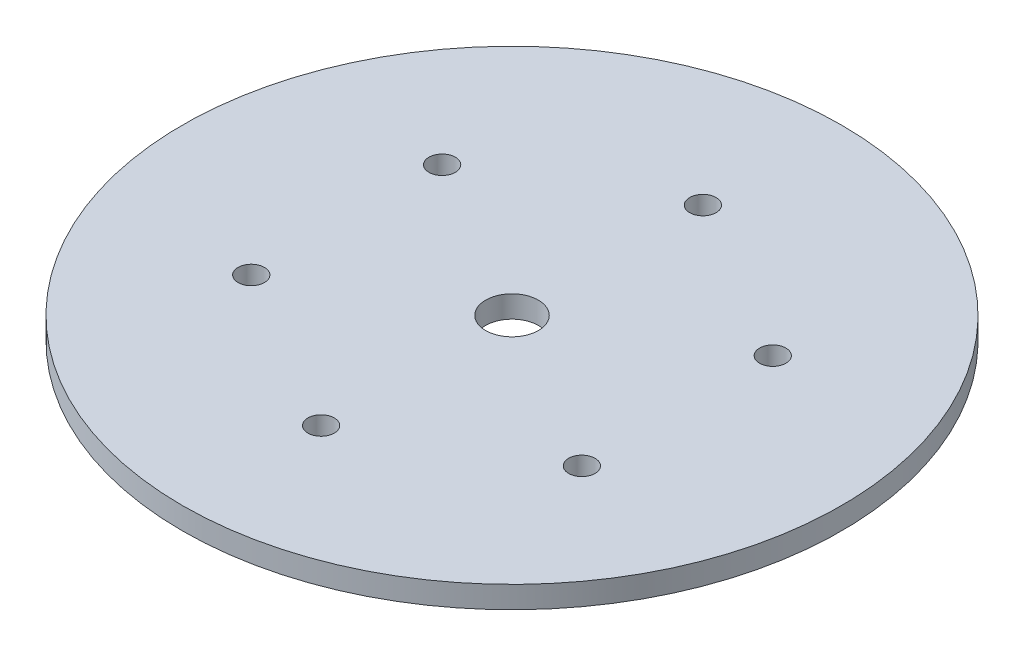
ISO-10303-21;
HEADER;
FILE_DESCRIPTION(('STEP AP214'),'2;1');
FILE_NAME('part.step','',(''),(''),'','','');
FILE_SCHEMA(('AUTOMOTIVE_DESIGN { 1 0 10303 214 1 1 1 1 }'));
ENDSEC;
DATA;
#1=APPLICATION_CONTEXT('core data for automotive mechanical design processes');
#2=APPLICATION_PROTOCOL_DEFINITION('international standard','automotive_design',2000,#1);
#3=PRODUCT_CONTEXT('',#1,'mechanical');
#4=PRODUCT('Part','Part','',(#3));
#5=PRODUCT_RELATED_PRODUCT_CATEGORY('part','',(#4));
#6=PRODUCT_DEFINITION_FORMATION('','',#4);
#7=PRODUCT_DEFINITION_CONTEXT('part definition',#1,'design');
#8=PRODUCT_DEFINITION('design','',#6,#7);
#9=PRODUCT_DEFINITION_SHAPE('','',#8);
#10=(LENGTH_UNIT() NAMED_UNIT(*) SI_UNIT(.MILLI.,.METRE.));
#11=(NAMED_UNIT(*) PLANE_ANGLE_UNIT() SI_UNIT($,.RADIAN.));
#12=(NAMED_UNIT(*) SI_UNIT($,.STERADIAN.) SOLID_ANGLE_UNIT());
#13=UNCERTAINTY_MEASURE_WITH_UNIT(LENGTH_MEASURE(1.E-05),#10,'distance_accuracy_value','');
#14=(GEOMETRIC_REPRESENTATION_CONTEXT(3) GLOBAL_UNCERTAINTY_ASSIGNED_CONTEXT((#13)) GLOBAL_UNIT_ASSIGNED_CONTEXT((#10,
#11,#12)) REPRESENTATION_CONTEXT('',''));
#15=CARTESIAN_POINT('',(0.,0.,0.));
#16=DIRECTION('',(0.,0.,1.));
#17=DIRECTION('',(1.,0.,0.));
#18=AXIS2_PLACEMENT_3D('',#15,#16,#17);
#19=CARTESIAN_POINT('',(0.,5.,0.));
#20=DIRECTION('',(0.,1.,0.));
#21=DIRECTION('',(0.,0.,1.));
#22=AXIS2_PLACEMENT_3D('',#19,#20,#21);
#23=PLANE('',#22);
#24=CARTESIAN_POINT('',(-37.6221783508924,5.,21.7211747983921));
#25=DIRECTION('',(0.,1.,0.));
#26=DIRECTION('',(0.,0.,1.));
#27=AXIS2_PLACEMENT_3D('',#24,#25,#26);
#28=CIRCLE('',#27,3.00000000000457);
#29=CARTESIAN_POINT('',(-37.6221783508924,5.,24.7211747983967));
#30=VERTEX_POINT('',#29);
#31=EDGE_CURVE('E73',#30,#30,#28,.T.);
#32=ORIENTED_EDGE('',*,*,#31,.F.);
#33=EDGE_LOOP('',(#32));
#34=FACE_BOUND('',#33,.T.);
#35=CARTESIAN_POINT('',(37.6221783508998,5.,21.7211747983879));
#36=DIRECTION('',(0.,1.,0.));
#37=DIRECTION('',(0.,0.,1.));
#38=AXIS2_PLACEMENT_3D('',#35,#36,#37);
#39=CIRCLE('',#38,3.0000000000031);
#40=CARTESIAN_POINT('',(37.6221783508998,5.,24.721174798391));
#41=VERTEX_POINT('',#40);
#42=EDGE_CURVE('E61',#41,#41,#39,.T.);
#43=ORIENTED_EDGE('',*,*,#42,.F.);
#44=EDGE_LOOP('',(#43));
#45=FACE_BOUND('',#44,.T.);
#46=CARTESIAN_POINT('',(0.,5.,0.));
#47=DIRECTION('',(0.,1.,0.));
#48=DIRECTION('',(0.,0.,1.));
#49=AXIS2_PLACEMENT_3D('',#46,#47,#48);
#50=CIRCLE('',#49,6.);
#51=CARTESIAN_POINT('',(0.,5.,6.));
#52=VERTEX_POINT('',#51);
#53=EDGE_CURVE('E49',#52,#52,#50,.T.);
#54=ORIENTED_EDGE('',*,*,#53,.F.);
#55=EDGE_LOOP('',(#54));
#56=FACE_BOUND('',#55,.T.);
#57=CARTESIAN_POINT('',(0.,5.,0.));
#58=DIRECTION('',(0.,1.,0.));
#59=DIRECTION('',(0.,0.,1.));
#60=AXIS2_PLACEMENT_3D('',#57,#58,#59);
#61=CIRCLE('',#60,75.);
#62=CARTESIAN_POINT('',(0.,5.,75.));
#63=VERTEX_POINT('',#62);
#64=EDGE_CURVE('E10',#63,#63,#61,.T.);
#65=ORIENTED_EDGE('',*,*,#64,.T.);
#66=EDGE_LOOP('',(#65));
#67=FACE_BOUND('',#66,.T.);
#68=CARTESIAN_POINT('',(0.,5.,-43.44234959678));
#69=DIRECTION('',(0.,1.,0.));
#70=DIRECTION('',(0.,0.,1.));
#71=AXIS2_PLACEMENT_3D('',#68,#69,#70);
#72=CIRCLE('',#71,3.);
#73=CARTESIAN_POINT('',(0.,5.,-40.44234959678));
#74=VERTEX_POINT('',#73);
#75=EDGE_CURVE('E44',#74,#74,#72,.T.);
#76=ORIENTED_EDGE('',*,*,#75,.F.);
#77=EDGE_LOOP('',(#76));
#78=FACE_BOUND('',#77,.T.);
#79=CARTESIAN_POINT('',(37.6221783508974,5.,-21.7211747983921));
#80=DIRECTION('',(0.,1.,0.));
#81=DIRECTION('',(0.,0.,1.));
#82=AXIS2_PLACEMENT_3D('',#79,#80,#81);
#83=CIRCLE('',#82,3.00000000000066);
#84=CARTESIAN_POINT('',(37.6221783508974,5.,-18.7211747983915));
#85=VERTEX_POINT('',#84);
#86=EDGE_CURVE('E55',#85,#85,#83,.T.);
#87=ORIENTED_EDGE('',*,*,#86,.F.);
#88=EDGE_LOOP('',(#87));
#89=FACE_BOUND('',#88,.T.);
#90=CARTESIAN_POINT('',(4.92818304197861E-12,5.,43.44234959678));
#91=DIRECTION('',(0.,1.,0.));
#92=DIRECTION('',(0.,0.,1.));
#93=AXIS2_PLACEMENT_3D('',#90,#91,#92);
#94=CIRCLE('',#93,3.000000000005);
#95=CARTESIAN_POINT('',(4.92818304197861E-12,5.,46.442349596785));
#96=VERTEX_POINT('',#95);
#97=EDGE_CURVE('E67',#96,#96,#94,.T.);
#98=ORIENTED_EDGE('',*,*,#97,.F.);
#99=EDGE_LOOP('',(#98));
#100=FACE_BOUND('',#99,.T.);
#101=CARTESIAN_POINT('',(-37.6221783508949,5.,-21.7211747983878));
#102=DIRECTION('',(0.,1.,0.));
#103=DIRECTION('',(0.,0.,1.));
#104=AXIS2_PLACEMENT_3D('',#101,#102,#103);
#105=CIRCLE('',#104,3.00000000000232);
#106=CARTESIAN_POINT('',(-37.6221783508949,5.,-18.7211747983855));
#107=VERTEX_POINT('',#106);
#108=EDGE_CURVE('E79',#107,#107,#105,.T.);
#109=ORIENTED_EDGE('',*,*,#108,.F.);
#110=EDGE_LOOP('',(#109));
#111=FACE_BOUND('',#110,.T.);
#112=ADVANCED_FACE('F33',(#34,#45,#56,#67,#78,#89,#100,#111),#23,.T.);
#113=CARTESIAN_POINT('',(0.,0.,0.));
#114=DIRECTION('',(0.,1.,0.));
#115=DIRECTION('',(0.,0.,1.));
#116=AXIS2_PLACEMENT_3D('',#113,#114,#115);
#117=PLANE('',#116);
#118=CARTESIAN_POINT('',(0.,0.,0.));
#119=DIRECTION('',(0.,1.,0.));
#120=DIRECTION('',(0.,0.,1.));
#121=AXIS2_PLACEMENT_3D('',#118,#119,#120);
#122=CIRCLE('',#121,75.);
#123=CARTESIAN_POINT('',(0.,0.,75.));
#124=VERTEX_POINT('',#123);
#125=EDGE_CURVE('E37',#124,#124,#122,.T.);
#126=ORIENTED_EDGE('',*,*,#125,.F.);
#127=EDGE_LOOP('',(#126));
#128=FACE_BOUND('',#127,.T.);
#129=CARTESIAN_POINT('',(0.,0.,-43.44234959678));
#130=DIRECTION('',(0.,1.,0.));
#131=DIRECTION('',(0.,0.,1.));
#132=AXIS2_PLACEMENT_3D('',#129,#130,#131);
#133=CIRCLE('',#132,3.);
#134=CARTESIAN_POINT('',(0.,0.,-40.44234959678));
#135=VERTEX_POINT('',#134);
#136=EDGE_CURVE('E46',#135,#135,#133,.T.);
#137=ORIENTED_EDGE('',*,*,#136,.T.);
#138=EDGE_LOOP('',(#137));
#139=FACE_BOUND('',#138,.T.);
#140=CARTESIAN_POINT('',(0.,0.,0.));
#141=DIRECTION('',(0.,1.,0.));
#142=DIRECTION('',(0.,0.,1.));
#143=AXIS2_PLACEMENT_3D('',#140,#141,#142);
#144=CIRCLE('',#143,6.);
#145=CARTESIAN_POINT('',(0.,0.,6.));
#146=VERTEX_POINT('',#145);
#147=EDGE_CURVE('E52',#146,#146,#144,.T.);
#148=ORIENTED_EDGE('',*,*,#147,.T.);
#149=EDGE_LOOP('',(#148));
#150=FACE_BOUND('',#149,.T.);
#151=CARTESIAN_POINT('',(37.6221783508974,0.,-21.7211747983921));
#152=DIRECTION('',(0.,1.,0.));
#153=DIRECTION('',(0.,0.,1.));
#154=AXIS2_PLACEMENT_3D('',#151,#152,#153);
#155=CIRCLE('',#154,3.00000000000066);
#156=CARTESIAN_POINT('',(37.6221783508974,0.,-18.7211747983915));
#157=VERTEX_POINT('',#156);
#158=EDGE_CURVE('E58',#157,#157,#155,.T.);
#159=ORIENTED_EDGE('',*,*,#158,.T.);
#160=EDGE_LOOP('',(#159));
#161=FACE_BOUND('',#160,.T.);
#162=CARTESIAN_POINT('',(37.6221783508998,0.,21.7211747983879));
#163=DIRECTION('',(0.,1.,0.));
#164=DIRECTION('',(0.,0.,1.));
#165=AXIS2_PLACEMENT_3D('',#162,#163,#164);
#166=CIRCLE('',#165,3.0000000000031);
#167=CARTESIAN_POINT('',(37.6221783508998,0.,24.721174798391));
#168=VERTEX_POINT('',#167);
#169=EDGE_CURVE('E64',#168,#168,#166,.T.);
#170=ORIENTED_EDGE('',*,*,#169,.T.);
#171=EDGE_LOOP('',(#170));
#172=FACE_BOUND('',#171,.T.);
#173=CARTESIAN_POINT('',(4.92818304197861E-12,0.,43.44234959678));
#174=DIRECTION('',(0.,1.,0.));
#175=DIRECTION('',(0.,0.,1.));
#176=AXIS2_PLACEMENT_3D('',#173,#174,#175);
#177=CIRCLE('',#176,3.000000000005);
#178=CARTESIAN_POINT('',(4.92818304197861E-12,0.,46.442349596785));
#179=VERTEX_POINT('',#178);
#180=EDGE_CURVE('E70',#179,#179,#177,.T.);
#181=ORIENTED_EDGE('',*,*,#180,.T.);
#182=EDGE_LOOP('',(#181));
#183=FACE_BOUND('',#182,.T.);
#184=CARTESIAN_POINT('',(-37.6221783508924,0.,21.7211747983921));
#185=DIRECTION('',(0.,1.,0.));
#186=DIRECTION('',(0.,0.,1.));
#187=AXIS2_PLACEMENT_3D('',#184,#185,#186);
#188=CIRCLE('',#187,3.00000000000457);
#189=CARTESIAN_POINT('',(-37.6221783508924,0.,24.7211747983967));
#190=VERTEX_POINT('',#189);
#191=EDGE_CURVE('E76',#190,#190,#188,.T.);
#192=ORIENTED_EDGE('',*,*,#191,.T.);
#193=EDGE_LOOP('',(#192));
#194=FACE_BOUND('',#193,.T.);
#195=CARTESIAN_POINT('',(-37.6221783508949,0.,-21.7211747983878));
#196=DIRECTION('',(0.,1.,0.));
#197=DIRECTION('',(0.,0.,1.));
#198=AXIS2_PLACEMENT_3D('',#195,#196,#197);
#199=CIRCLE('',#198,3.00000000000232);
#200=CARTESIAN_POINT('',(-37.6221783508949,0.,-18.7211747983855));
#201=VERTEX_POINT('',#200);
#202=EDGE_CURVE('E82',#201,#201,#199,.T.);
#203=ORIENTED_EDGE('',*,*,#202,.T.);
#204=EDGE_LOOP('',(#203));
#205=FACE_BOUND('',#204,.T.);
#206=ADVANCED_FACE('F92',(#128,#139,#150,#161,#172,#183,#194,#205),#117,.F.);
#207=CARTESIAN_POINT('',(0.,5.,0.));
#208=DIRECTION('',(0.,-1.,0.));
#209=DIRECTION('',(0.,0.,-1.));
#210=AXIS2_PLACEMENT_3D('',#207,#208,#209);
#211=CYLINDRICAL_SURFACE('',#210,75.);
#212=ORIENTED_EDGE('',*,*,#64,.F.);
#213=EDGE_LOOP('',(#212));
#214=FACE_BOUND('',#213,.T.);
#215=ORIENTED_EDGE('',*,*,#125,.T.);
#216=EDGE_LOOP('',(#215));
#217=FACE_BOUND('',#216,.T.);
#218=ADVANCED_FACE('F35',(#214,#217),#211,.T.);
#219=CARTESIAN_POINT('',(0.,5.,-43.44234959678));
#220=DIRECTION('',(0.,-1.,0.));
#221=DIRECTION('',(0.,0.,-1.));
#222=AXIS2_PLACEMENT_3D('',#219,#220,#221);
#223=CYLINDRICAL_SURFACE('',#222,3.);
#224=ORIENTED_EDGE('',*,*,#75,.T.);
#225=EDGE_LOOP('',(#224));
#226=FACE_BOUND('',#225,.T.);
#227=ORIENTED_EDGE('',*,*,#136,.F.);
#228=EDGE_LOOP('',(#227));
#229=FACE_BOUND('',#228,.T.);
#230=ADVANCED_FACE('F102',(#226,#229),#223,.F.);
#231=CARTESIAN_POINT('',(0.,5.,0.));
#232=DIRECTION('',(0.,-1.,0.));
#233=DIRECTION('',(0.,0.,-1.));
#234=AXIS2_PLACEMENT_3D('',#231,#232,#233);
#235=CYLINDRICAL_SURFACE('',#234,6.);
#236=ORIENTED_EDGE('',*,*,#53,.T.);
#237=EDGE_LOOP('',(#236));
#238=FACE_BOUND('',#237,.T.);
#239=ORIENTED_EDGE('',*,*,#147,.F.);
#240=EDGE_LOOP('',(#239));
#241=FACE_BOUND('',#240,.T.);
#242=ADVANCED_FACE('F105',(#238,#241),#235,.F.);
#243=CARTESIAN_POINT('',(37.6221783508974,5.,-21.7211747983921));
#244=DIRECTION('',(0.,-1.,0.));
#245=DIRECTION('',(0.,0.,-1.));
#246=AXIS2_PLACEMENT_3D('',#243,#244,#245);
#247=CYLINDRICAL_SURFACE('',#246,3.00000000000066);
#248=ORIENTED_EDGE('',*,*,#86,.T.);
#249=EDGE_LOOP('',(#248));
#250=FACE_BOUND('',#249,.T.);
#251=ORIENTED_EDGE('',*,*,#158,.F.);
#252=EDGE_LOOP('',(#251));
#253=FACE_BOUND('',#252,.T.);
#254=ADVANCED_FACE('F109',(#250,#253),#247,.F.);
#255=CARTESIAN_POINT('',(37.6221783508998,5.,21.7211747983879));
#256=DIRECTION('',(0.,-1.,0.));
#257=DIRECTION('',(0.,0.,-1.));
#258=AXIS2_PLACEMENT_3D('',#255,#256,#257);
#259=CYLINDRICAL_SURFACE('',#258,3.0000000000031);
#260=ORIENTED_EDGE('',*,*,#42,.T.);
#261=EDGE_LOOP('',(#260));
#262=FACE_BOUND('',#261,.T.);
#263=ORIENTED_EDGE('',*,*,#169,.F.);
#264=EDGE_LOOP('',(#263));
#265=FACE_BOUND('',#264,.T.);
#266=ADVANCED_FACE('F113',(#262,#265),#259,.F.);
#267=CARTESIAN_POINT('',(4.92818304197861E-12,5.,43.44234959678));
#268=DIRECTION('',(0.,-1.,0.));
#269=DIRECTION('',(0.,0.,-1.));
#270=AXIS2_PLACEMENT_3D('',#267,#268,#269);
#271=CYLINDRICAL_SURFACE('',#270,3.000000000005);
#272=ORIENTED_EDGE('',*,*,#97,.T.);
#273=EDGE_LOOP('',(#272));
#274=FACE_BOUND('',#273,.T.);
#275=ORIENTED_EDGE('',*,*,#180,.F.);
#276=EDGE_LOOP('',(#275));
#277=FACE_BOUND('',#276,.T.);
#278=ADVANCED_FACE('F117',(#274,#277),#271,.F.);
#279=CARTESIAN_POINT('',(-37.6221783508924,5.,21.7211747983921));
#280=DIRECTION('',(0.,-1.,0.));
#281=DIRECTION('',(0.,0.,-1.));
#282=AXIS2_PLACEMENT_3D('',#279,#280,#281);
#283=CYLINDRICAL_SURFACE('',#282,3.00000000000457);
#284=ORIENTED_EDGE('',*,*,#31,.T.);
#285=EDGE_LOOP('',(#284));
#286=FACE_BOUND('',#285,.T.);
#287=ORIENTED_EDGE('',*,*,#191,.F.);
#288=EDGE_LOOP('',(#287));
#289=FACE_BOUND('',#288,.T.);
#290=ADVANCED_FACE('F121',(#286,#289),#283,.F.);
#291=CARTESIAN_POINT('',(-37.6221783508949,5.,-21.7211747983878));
#292=DIRECTION('',(0.,-1.,0.));
#293=DIRECTION('',(0.,0.,-1.));
#294=AXIS2_PLACEMENT_3D('',#291,#292,#293);
#295=CYLINDRICAL_SURFACE('',#294,3.00000000000232);
#296=ORIENTED_EDGE('',*,*,#108,.T.);
#297=EDGE_LOOP('',(#296));
#298=FACE_BOUND('',#297,.T.);
#299=ORIENTED_EDGE('',*,*,#202,.F.);
#300=EDGE_LOOP('',(#299));
#301=FACE_BOUND('',#300,.T.);
#302=ADVANCED_FACE('F88',(#298,#301),#295,.F.);
#303=CLOSED_SHELL('',(#112,#206,#218,#230,#242,#254,#266,#278,#290,#302));
#304=MANIFOLD_SOLID_BREP('B2',#303);
#305=ADVANCED_BREP_SHAPE_REPRESENTATION('',(#18,#304),#14);
#306=SHAPE_DEFINITION_REPRESENTATION(#9,#305);
ENDSEC;
END-ISO-10303-21;
